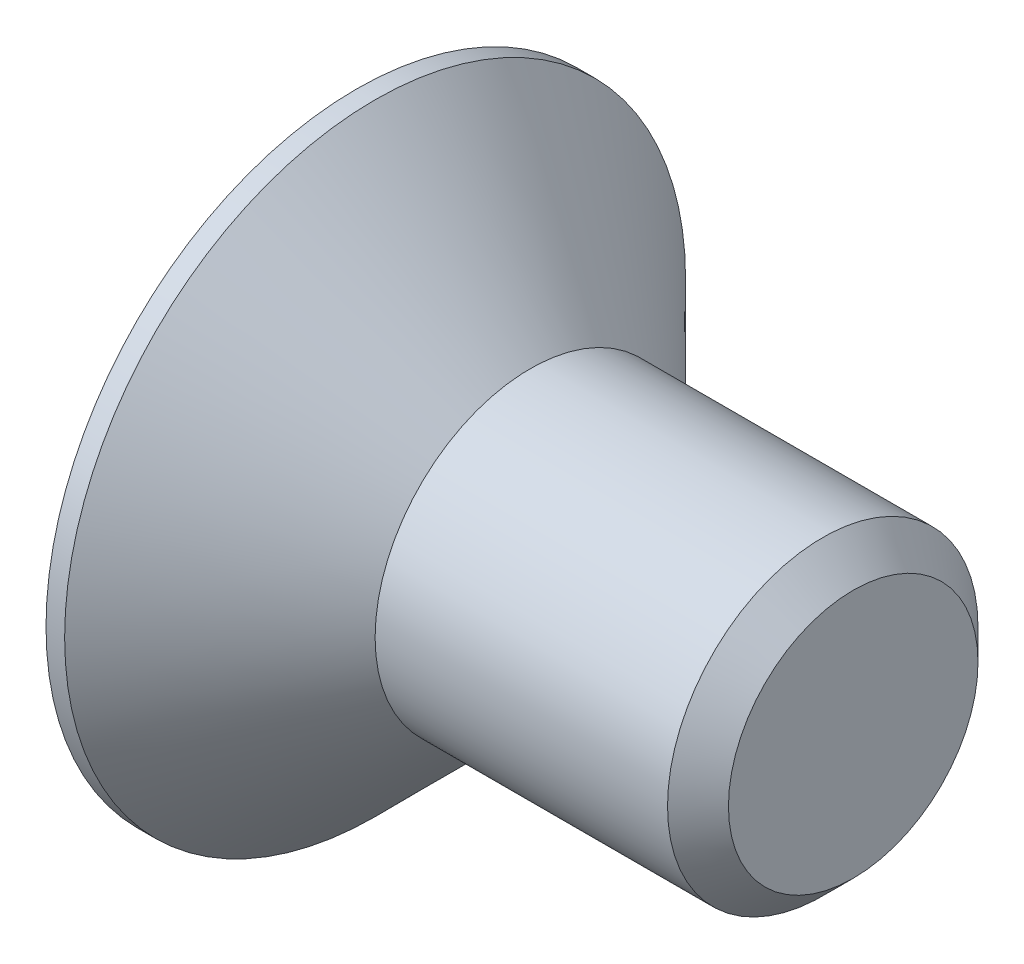
ISO-10303-21;
HEADER;
FILE_DESCRIPTION(('STEP AP214'),'2;1');
FILE_NAME('part.step','',(''),(''),'','','');
FILE_SCHEMA(('AUTOMOTIVE_DESIGN { 1 0 10303 214 1 1 1 1 }'));
ENDSEC;
DATA;
#1=APPLICATION_CONTEXT('core data for automotive mechanical design processes');
#2=APPLICATION_PROTOCOL_DEFINITION('international standard','automotive_design',2000,#1);
#3=PRODUCT_CONTEXT('',#1,'mechanical');
#4=PRODUCT('Part','Part','',(#3));
#5=PRODUCT_RELATED_PRODUCT_CATEGORY('part','',(#4));
#6=PRODUCT_DEFINITION_FORMATION('','',#4);
#7=PRODUCT_DEFINITION_CONTEXT('part definition',#1,'design');
#8=PRODUCT_DEFINITION('design','',#6,#7);
#9=PRODUCT_DEFINITION_SHAPE('','',#8);
#10=(LENGTH_UNIT() NAMED_UNIT(*) SI_UNIT(.MILLI.,.METRE.));
#11=(NAMED_UNIT(*) PLANE_ANGLE_UNIT() SI_UNIT($,.RADIAN.));
#12=(NAMED_UNIT(*) SI_UNIT($,.STERADIAN.) SOLID_ANGLE_UNIT());
#13=UNCERTAINTY_MEASURE_WITH_UNIT(LENGTH_MEASURE(1.E-05),#10,'distance_accuracy_value','');
#14=(GEOMETRIC_REPRESENTATION_CONTEXT(3) GLOBAL_UNCERTAINTY_ASSIGNED_CONTEXT((#13)) GLOBAL_UNIT_ASSIGNED_CONTEXT((#10,
#11,#12)) REPRESENTATION_CONTEXT('',''));
#15=CARTESIAN_POINT('',(0.,0.,0.));
#16=DIRECTION('',(0.,0.,1.));
#17=DIRECTION('',(1.,0.,0.));
#18=AXIS2_PLACEMENT_3D('',#15,#16,#17);
#19=CARTESIAN_POINT('',(-2.79999999999997,1.11022302462516E-13,-8.32667268468867E-13));
#20=DIRECTION('',(1.,0.,0.));
#21=DIRECTION('',(0.,0.,-1.00000000000002));
#22=AXIS2_PLACEMENT_3D('',#19,#20,#21);
#23=PLANE('',#22);
#24=CARTESIAN_POINT('',(-2.79999999999997,1.11022302462516E-13,-8.32667268468867E-13));
#25=DIRECTION('',(1.,0.,0.));
#26=DIRECTION('',(0.,0.,-1.00000000000002));
#27=AXIS2_PLACEMENT_3D('',#24,#25,#26);
#28=CIRCLE('',#27,5.);
#29=CARTESIAN_POINT('',(-2.79999999999997,1.10189635194047E-13,-5.00000000000092));
#30=VERTEX_POINT('',#29);
#31=EDGE_CURVE('E11',#30,#30,#28,.T.);
#32=ORIENTED_EDGE('',*,*,#31,.F.);
#33=EDGE_LOOP('',(#32));
#34=FACE_BOUND('',#33,.T.);
#35=DIRECTION('',(0.,0.500000000000011,-0.866025403784455));
#36=VECTOR('',#35,1.);
#37=CARTESIAN_POINT('',(-2.79999999999947,-1.73205080756911,4.44089209850063E-13));
#38=LINE('',#37,#36);
#39=CARTESIAN_POINT('',(-2.79999999999947,-1.73205080756911,4.44089209850063E-13));
#40=VERTEX_POINT('',#39);
#41=CARTESIAN_POINT('',(-2.7999999999998,-0.866025403784221,-1.50000000000039));
#42=VERTEX_POINT('',#41);
#43=EDGE_CURVE('E149',#40,#42,#38,.T.);
#44=ORIENTED_EDGE('',*,*,#43,.T.);
#45=DIRECTION('',(0.,1.00000000000002,0.));
#46=VECTOR('',#45,1.);
#47=CARTESIAN_POINT('',(-2.7999999999998,-0.866025403784221,-1.50000000000039));
#48=LINE('',#47,#46);
#49=CARTESIAN_POINT('',(-2.80000000000019,0.866025403784443,-1.50000000000078));
#50=VERTEX_POINT('',#49);
#51=EDGE_CURVE('E151',#42,#50,#48,.T.);
#52=ORIENTED_EDGE('',*,*,#51,.T.);
#53=DIRECTION('',(0.,0.500000000000011,0.866025403784455));
#54=VECTOR('',#53,1.);
#55=CARTESIAN_POINT('',(-2.80000000000019,0.866025403784443,-1.50000000000078));
#56=LINE('',#55,#54);
#57=CARTESIAN_POINT('',(-2.80000000000069,1.73205080756911,-8.88178419700125E-13));
#58=VERTEX_POINT('',#57);
#59=EDGE_CURVE('E154',#50,#58,#56,.T.);
#60=ORIENTED_EDGE('',*,*,#59,.T.);
#61=DIRECTION('',(0.,-0.500000000000011,0.866025403784455));
#62=VECTOR('',#61,1.);
#63=CARTESIAN_POINT('',(-2.80000000000069,1.73205080756911,-8.88178419700125E-13));
#64=LINE('',#63,#62);
#65=CARTESIAN_POINT('',(-2.80000000000036,0.866025403784998,1.49999999999961));
#66=VERTEX_POINT('',#65);
#67=EDGE_CURVE('E99',#58,#66,#64,.T.);
#68=ORIENTED_EDGE('',*,*,#67,.T.);
#69=DIRECTION('',(0.,-1.00000000000002,0.));
#70=VECTOR('',#69,1.);
#71=CARTESIAN_POINT('',(-2.80000000000036,0.866025403784998,1.49999999999961));
#72=LINE('',#71,#70);
#73=CARTESIAN_POINT('',(-2.79999999999997,-0.866025403784443,1.49999999999956));
#74=VERTEX_POINT('',#73);
#75=EDGE_CURVE('E156',#66,#74,#72,.T.);
#76=ORIENTED_EDGE('',*,*,#75,.T.);
#77=DIRECTION('',(0.,-0.500000000000011,-0.866025403784455));
#78=VECTOR('',#77,1.);
#79=CARTESIAN_POINT('',(-2.79999999999997,-0.866025403784443,1.49999999999956));
#80=LINE('',#79,#78);
#81=EDGE_CURVE('E114',#74,#40,#80,.T.);
#82=ORIENTED_EDGE('',*,*,#81,.T.);
#83=EDGE_LOOP('',(#44,#52,#60,#68,#76,#82));
#84=FACE_BOUND('',#83,.T.);
#85=ADVANCED_FACE('F16',(#34,#84),#23,.F.);
#86=CARTESIAN_POINT('',(5.19999999999998,0.,-5.55111512312578E-13));
#87=DIRECTION('',(1.,0.,0.));
#88=DIRECTION('',(0.,0.,-1.00000000000002));
#89=AXIS2_PLACEMENT_3D('',#86,#87,#88);
#90=CYLINDRICAL_SURFACE('',#89,5.);
#91=CARTESIAN_POINT('',(-2.5,2.22044604925031E-13,-1.0547118733939E-12));
#92=DIRECTION('',(1.,0.,0.));
#93=DIRECTION('',(0.,0.,-1.00000000000002));
#94=AXIS2_PLACEMENT_3D('',#91,#92,#93);
#95=CIRCLE('',#94,5.);
#96=CARTESIAN_POINT('',(-2.5,2.21211937656562E-13,-5.00000000000114));
#97=VERTEX_POINT('',#96);
#98=EDGE_CURVE('E23',#97,#97,#95,.T.);
#99=ORIENTED_EDGE('',*,*,#98,.F.);
#100=EDGE_LOOP('',(#99));
#101=FACE_BOUND('',#100,.T.);
#102=ORIENTED_EDGE('',*,*,#31,.T.);
#103=EDGE_LOOP('',(#102));
#104=FACE_BOUND('',#103,.T.);
#105=ADVANCED_FACE('F140',(#101,#104),#90,.T.);
#106=CARTESIAN_POINT('',(-2.5,2.22044604925031E-13,-1.0547118733939E-12));
#107=DIRECTION('',(-1.,0.,0.));
#108=DIRECTION('',(0.,0.,1.00000000000002));
#109=AXIS2_PLACEMENT_3D('',#106,#107,#108);
#110=CONICAL_SURFACE('',#109,5.,0.785398163397448);
#111=CARTESIAN_POINT('',(0.,0.,0.));
#112=DIRECTION('',(1.,0.,0.));
#113=DIRECTION('',(0.,0.,-1.00000000000002));
#114=AXIS2_PLACEMENT_3D('',#111,#112,#113);
#115=CIRCLE('',#114,2.5);
#116=CARTESIAN_POINT('',(0.,0.,-2.50000000000004));
#117=VERTEX_POINT('',#116);
#118=EDGE_CURVE('E133',#117,#117,#115,.T.);
#119=ORIENTED_EDGE('',*,*,#118,.F.);
#120=EDGE_LOOP('',(#119));
#121=FACE_BOUND('',#120,.T.);
#122=ORIENTED_EDGE('',*,*,#98,.T.);
#123=EDGE_LOOP('',(#122));
#124=FACE_BOUND('',#123,.T.);
#125=ADVANCED_FACE('F138',(#121,#124),#110,.T.);
#126=CARTESIAN_POINT('',(5.19999999999998,0.,-5.55111512312578E-13));
#127=DIRECTION('',(1.,0.,0.));
#128=DIRECTION('',(0.,0.,-1.00000000000002));
#129=AXIS2_PLACEMENT_3D('',#126,#127,#128);
#130=CYLINDRICAL_SURFACE('',#129,2.5);
#131=CARTESIAN_POINT('',(4.70949999999998,-7.7715611723761E-13,-2.22044604925031E-13));
#132=DIRECTION('',(1.,0.,0.));
#133=DIRECTION('',(0.,0.,-1.00000000000002));
#134=AXIS2_PLACEMENT_3D('',#131,#132,#133);
#135=CIRCLE('',#134,2.5);
#136=CARTESIAN_POINT('',(4.70949999999998,-7.77572450871844E-13,-2.50000000000027));
#137=VERTEX_POINT('',#136);
#138=EDGE_CURVE('E130',#137,#137,#135,.T.);
#139=ORIENTED_EDGE('',*,*,#138,.F.);
#140=EDGE_LOOP('',(#139));
#141=FACE_BOUND('',#140,.T.);
#142=ORIENTED_EDGE('',*,*,#118,.T.);
#143=EDGE_LOOP('',(#142));
#144=FACE_BOUND('',#143,.T.);
#145=ADVANCED_FACE('F243',(#141,#144),#130,.T.);
#146=CARTESIAN_POINT('',(4.70949999999998,-7.7715611723761E-13,-2.22044604925031E-13));
#147=DIRECTION('',(-1.,0.,0.));
#148=DIRECTION('',(0.,0.,1.00000000000002));
#149=AXIS2_PLACEMENT_3D('',#146,#147,#148);
#150=CONICAL_SURFACE('',#149,2.5,0.785398163397448);
#151=CARTESIAN_POINT('',(5.19999999999998,0.,-5.55111512312578E-13));
#152=DIRECTION('',(1.,0.,0.));
#153=DIRECTION('',(0.,0.,-1.00000000000002));
#154=AXIS2_PLACEMENT_3D('',#151,#152,#153);
#155=CIRCLE('',#154,2.0095);
#156=CARTESIAN_POINT('',(5.19999999999998,0.,-2.00950000000059));
#157=VERTEX_POINT('',#156);
#158=EDGE_CURVE('E126',#157,#157,#155,.T.);
#159=ORIENTED_EDGE('',*,*,#158,.F.);
#160=EDGE_LOOP('',(#159));
#161=FACE_BOUND('',#160,.T.);
#162=ORIENTED_EDGE('',*,*,#138,.T.);
#163=EDGE_LOOP('',(#162));
#164=FACE_BOUND('',#163,.T.);
#165=ADVANCED_FACE('F239',(#161,#164),#150,.T.);
#166=CARTESIAN_POINT('',(5.19999999999943,2.00950000000022,-6.10622663543836E-13));
#167=DIRECTION('',(-1.,0.,0.));
#168=DIRECTION('',(0.,0.,1.00000000000002));
#169=AXIS2_PLACEMENT_3D('',#166,#167,#168);
#170=PLANE('',#169);
#171=ORIENTED_EDGE('',*,*,#158,.T.);
#172=EDGE_LOOP('',(#171));
#173=FACE_BOUND('',#172,.T.);
#174=ADVANCED_FACE('F234',(#173),#170,.F.);
#175=CARTESIAN_POINT('',(-1.4000000000004,0.866025403784665,1.50000000000011));
#176=DIRECTION('',(0.,0.,-1.00000000000002));
#177=DIRECTION('',(-1.,0.,0.));
#178=AXIS2_PLACEMENT_3D('',#175,#176,#177);
#179=PLANE('',#178);
#180=ORIENTED_EDGE('',*,*,#75,.F.);
#181=DIRECTION('',(-1.,0.,0.));
#182=VECTOR('',#181,1.);
#183=CARTESIAN_POINT('',(-1.4000000000004,0.866025403784665,1.50000000000011));
#184=LINE('',#183,#182);
#185=CARTESIAN_POINT('',(-1.4000000000004,0.866025403784665,1.50000000000011));
#186=VERTEX_POINT('',#185);
#187=EDGE_CURVE('E163',#186,#66,#184,.T.);
#188=ORIENTED_EDGE('',*,*,#187,.F.);
#189=DIRECTION('',(0.,-1.00000000000002,0.));
#190=VECTOR('',#189,1.);
#191=CARTESIAN_POINT('',(-1.4000000000004,0.866025403784665,1.50000000000011));
#192=LINE('',#191,#190);
#193=CARTESIAN_POINT('',(-1.40000000000007,0.,1.49999999999906));
#194=VERTEX_POINT('',#193);
#195=EDGE_CURVE('E96',#186,#194,#192,.T.);
#196=ORIENTED_EDGE('',*,*,#195,.T.);
#197=CARTESIAN_POINT('',(-1.39999999999996,-0.866025403784887,1.49999999999995));
#198=VERTEX_POINT('',#197);
#199=EDGE_CURVE('E88',#194,#198,#192,.T.);
#200=ORIENTED_EDGE('',*,*,#199,.T.);
#201=DIRECTION('',(-1.,0.,0.));
#202=VECTOR('',#201,1.);
#203=CARTESIAN_POINT('',(-1.39999999999996,-0.866025403784887,1.49999999999995));
#204=LINE('',#203,#202);
#205=EDGE_CURVE('E92',#198,#74,#204,.T.);
#206=ORIENTED_EDGE('',*,*,#205,.T.);
#207=EDGE_LOOP('',(#180,#188,#196,#200,#206));
#208=FACE_BOUND('',#207,.T.);
#209=ADVANCED_FACE('F90',(#208),#179,.T.);
#210=CARTESIAN_POINT('',(-1.39999999999996,-0.866025403784887,1.49999999999995));
#211=DIRECTION('',(0.,0.86602540378446,-0.500000000000009));
#212=DIRECTION('',(0.,0.500000000000011,0.866025403784455));
#213=AXIS2_PLACEMENT_3D('',#210,#211,#212);
#214=PLANE('',#213);
#215=ORIENTED_EDGE('',*,*,#81,.F.);
#216=ORIENTED_EDGE('',*,*,#205,.F.);
#217=DIRECTION('',(0.,-0.500000000000011,-0.866025403784455));
#218=VECTOR('',#217,1.);
#219=CARTESIAN_POINT('',(-1.39999999999996,-0.866025403784887,1.49999999999995));
#220=LINE('',#219,#218);
#221=CARTESIAN_POINT('',(-1.39999999999979,-1.29903810567655,0.749999999999917));
#222=VERTEX_POINT('',#221);
#223=EDGE_CURVE('E102',#198,#222,#220,.T.);
#224=ORIENTED_EDGE('',*,*,#223,.T.);
#225=CARTESIAN_POINT('',(-1.39999999999951,-1.73205080756922,1.11022302462516E-13));
#226=VERTEX_POINT('',#225);
#227=EDGE_CURVE('E109',#222,#226,#220,.T.);
#228=ORIENTED_EDGE('',*,*,#227,.T.);
#229=DIRECTION('',(-1.,0.,0.));
#230=VECTOR('',#229,1.);
#231=CARTESIAN_POINT('',(-1.39999999999951,-1.73205080756922,1.11022302462516E-13));
#232=LINE('',#231,#230);
#233=EDGE_CURVE('E116',#226,#40,#232,.T.);
#234=ORIENTED_EDGE('',*,*,#233,.T.);
#235=EDGE_LOOP('',(#215,#216,#224,#228,#234));
#236=FACE_BOUND('',#235,.T.);
#237=ADVANCED_FACE('F111',(#236),#214,.T.);
#238=CARTESIAN_POINT('',(-1.39999999999951,-1.73205080756922,1.11022302462516E-13));
#239=DIRECTION('',(0.,0.86602540378446,0.500000000000008));
#240=DIRECTION('',(0.,-0.500000000000011,0.866025403784455));
#241=AXIS2_PLACEMENT_3D('',#238,#239,#240);
#242=PLANE('',#241);
#243=ORIENTED_EDGE('',*,*,#43,.F.);
#244=ORIENTED_EDGE('',*,*,#233,.F.);
#245=DIRECTION('',(0.,0.500000000000011,-0.866025403784455));
#246=VECTOR('',#245,1.);
#247=CARTESIAN_POINT('',(-1.39999999999951,-1.73205080756922,1.11022302462516E-13));
#248=LINE('',#247,#246);
#249=CARTESIAN_POINT('',(-1.39999999999968,-1.29903810567666,-0.749999999999973));
#250=VERTEX_POINT('',#249);
#251=EDGE_CURVE('E30',#226,#250,#248,.T.);
#252=ORIENTED_EDGE('',*,*,#251,.T.);
#253=CARTESIAN_POINT('',(-1.39999999999985,-0.866025403784665,-1.5000000000005));
#254=VERTEX_POINT('',#253);
#255=EDGE_CURVE('E108',#250,#254,#248,.T.);
#256=ORIENTED_EDGE('',*,*,#255,.T.);
#257=DIRECTION('',(-1.,0.,0.));
#258=VECTOR('',#257,1.);
#259=CARTESIAN_POINT('',(-1.39999999999985,-0.866025403784665,-1.5000000000005));
#260=LINE('',#259,#258);
#261=EDGE_CURVE('E122',#254,#42,#260,.T.);
#262=ORIENTED_EDGE('',*,*,#261,.T.);
#263=EDGE_LOOP('',(#243,#244,#252,#256,#262));
#264=FACE_BOUND('',#263,.T.);
#265=ADVANCED_FACE('F173',(#264),#242,.T.);
#266=CARTESIAN_POINT('',(-1.39999999999985,-0.866025403784665,-1.5000000000005));
#267=DIRECTION('',(0.,0.,1.00000000000002));
#268=DIRECTION('',(1.,0.,0.));
#269=AXIS2_PLACEMENT_3D('',#266,#267,#268);
#270=PLANE('',#269);
#271=ORIENTED_EDGE('',*,*,#51,.F.);
#272=ORIENTED_EDGE('',*,*,#261,.F.);
#273=DIRECTION('',(0.,1.00000000000002,0.));
#274=VECTOR('',#273,1.);
#275=CARTESIAN_POINT('',(-1.39999999999985,-0.866025403784665,-1.5000000000005));
#276=LINE('',#275,#274);
#277=CARTESIAN_POINT('',(-1.40000000000007,0.,-1.50000000000017));
#278=VERTEX_POINT('',#277);
#279=EDGE_CURVE('E178',#254,#278,#276,.T.);
#280=ORIENTED_EDGE('',*,*,#279,.T.);
#281=CARTESIAN_POINT('',(-1.40000000000018,0.866025403784443,-1.50000000000083));
#282=VERTEX_POINT('',#281);
#283=EDGE_CURVE('E186',#278,#282,#276,.T.);
#284=ORIENTED_EDGE('',*,*,#283,.T.);
#285=DIRECTION('',(-1.,0.,0.));
#286=VECTOR('',#285,1.);
#287=CARTESIAN_POINT('',(-1.40000000000018,0.866025403784443,-1.50000000000083));
#288=LINE('',#287,#286);
#289=EDGE_CURVE('E170',#282,#50,#288,.T.);
#290=ORIENTED_EDGE('',*,*,#289,.T.);
#291=EDGE_LOOP('',(#271,#272,#280,#284,#290));
#292=FACE_BOUND('',#291,.T.);
#293=ADVANCED_FACE('F177',(#292),#270,.T.);
#294=CARTESIAN_POINT('',(-1.40000000000018,0.866025403784443,-1.50000000000083));
#295=DIRECTION('',(0.,-0.86602540378446,0.500000000000009));
#296=DIRECTION('',(0.,-0.500000000000011,-0.866025403784455));
#297=AXIS2_PLACEMENT_3D('',#294,#295,#296);
#298=PLANE('',#297);
#299=ORIENTED_EDGE('',*,*,#59,.F.);
#300=ORIENTED_EDGE('',*,*,#289,.F.);
#301=DIRECTION('',(0.,0.500000000000011,0.866025403784455));
#302=VECTOR('',#301,1.);
#303=CARTESIAN_POINT('',(-1.40000000000018,0.866025403784443,-1.50000000000083));
#304=LINE('',#303,#302);
#305=CARTESIAN_POINT('',(-1.40000000000068,1.29903810567678,-0.750000000000861));
#306=VERTEX_POINT('',#305);
#307=EDGE_CURVE('E188',#282,#306,#304,.T.);
#308=ORIENTED_EDGE('',*,*,#307,.T.);
#309=CARTESIAN_POINT('',(-1.40000000000068,1.732050807569,-6.10622663543836E-13));
#310=VERTEX_POINT('',#309);
#311=EDGE_CURVE('E185',#306,#310,#304,.T.);
#312=ORIENTED_EDGE('',*,*,#311,.T.);
#313=DIRECTION('',(-1.,0.,0.));
#314=VECTOR('',#313,1.);
#315=CARTESIAN_POINT('',(-1.40000000000068,1.732050807569,-6.10622663543836E-13));
#316=LINE('',#315,#314);
#317=EDGE_CURVE('E166',#310,#58,#316,.T.);
#318=ORIENTED_EDGE('',*,*,#317,.T.);
#319=EDGE_LOOP('',(#299,#300,#308,#312,#318));
#320=FACE_BOUND('',#319,.T.);
#321=ADVANCED_FACE('F216',(#320),#298,.T.);
#322=CARTESIAN_POINT('',(-1.40000000000068,1.732050807569,-6.10622663543836E-13));
#323=DIRECTION('',(0.,-0.86602540378446,-0.500000000000008));
#324=DIRECTION('',(0.,0.500000000000011,-0.866025403784455));
#325=AXIS2_PLACEMENT_3D('',#322,#323,#324);
#326=PLANE('',#325);
#327=ORIENTED_EDGE('',*,*,#67,.F.);
#328=ORIENTED_EDGE('',*,*,#317,.F.);
#329=DIRECTION('',(0.,-0.500000000000011,0.866025403784455));
#330=VECTOR('',#329,1.);
#331=CARTESIAN_POINT('',(-1.40000000000068,1.732050807569,-6.10622663543836E-13));
#332=LINE('',#331,#330);
#333=CARTESIAN_POINT('',(-1.40000000000068,1.299038105677,0.749999999999418));
#334=VERTEX_POINT('',#333);
#335=EDGE_CURVE('E167',#310,#334,#332,.T.);
#336=ORIENTED_EDGE('',*,*,#335,.T.);
#337=EDGE_CURVE('E193',#334,#186,#332,.T.);
#338=ORIENTED_EDGE('',*,*,#337,.T.);
#339=ORIENTED_EDGE('',*,*,#187,.T.);
#340=EDGE_LOOP('',(#327,#328,#336,#338,#339));
#341=FACE_BOUND('',#340,.T.);
#342=ADVANCED_FACE('F196',(#341),#326,.T.);
#343=CARTESIAN_POINT('',(-1.40000000000001,0.,0.));
#344=DIRECTION('',(1.,0.,0.));
#345=DIRECTION('',(0.,0.,-1.00000000000002));
#346=AXIS2_PLACEMENT_3D('',#343,#344,#345);
#347=PLANE('',#346);
#348=CARTESIAN_POINT('',(-1.40000000000001,0.,0.));
#349=DIRECTION('',(1.,0.,0.));
#350=DIRECTION('',(0.,0.,-1.00000000000002));
#351=AXIS2_PLACEMENT_3D('',#348,#349,#350);
#352=CIRCLE('',#351,1.5);
#353=EDGE_CURVE('E115',#278,#306,#352,.T.);
#354=ORIENTED_EDGE('',*,*,#353,.T.);
#355=ORIENTED_EDGE('',*,*,#307,.F.);
#356=ORIENTED_EDGE('',*,*,#283,.F.);
#357=EDGE_LOOP('',(#354,#355,#356));
#358=FACE_BOUND('',#357,.T.);
#359=ADVANCED_FACE('F211',(#358),#347,.F.);
#360=ORIENTED_EDGE('',*,*,#311,.F.);
#361=EDGE_CURVE('E121',#306,#334,#352,.T.);
#362=ORIENTED_EDGE('',*,*,#361,.T.);
#363=ORIENTED_EDGE('',*,*,#335,.F.);
#364=EDGE_LOOP('',(#360,#362,#363));
#365=FACE_BOUND('',#364,.T.);
#366=ADVANCED_FACE('F213',(#365),#347,.F.);
#367=EDGE_CURVE('E127',#334,#194,#352,.T.);
#368=ORIENTED_EDGE('',*,*,#367,.T.);
#369=ORIENTED_EDGE('',*,*,#195,.F.);
#370=ORIENTED_EDGE('',*,*,#337,.F.);
#371=EDGE_LOOP('',(#368,#369,#370));
#372=FACE_BOUND('',#371,.T.);
#373=ADVANCED_FACE('F202',(#372),#347,.F.);
#374=EDGE_CURVE('E104',#194,#222,#352,.T.);
#375=ORIENTED_EDGE('',*,*,#374,.T.);
#376=ORIENTED_EDGE('',*,*,#223,.F.);
#377=ORIENTED_EDGE('',*,*,#199,.F.);
#378=EDGE_LOOP('',(#375,#376,#377));
#379=FACE_BOUND('',#378,.T.);
#380=ADVANCED_FACE('F103',(#379),#347,.F.);
#381=EDGE_CURVE('E205',#222,#250,#352,.T.);
#382=ORIENTED_EDGE('',*,*,#381,.T.);
#383=ORIENTED_EDGE('',*,*,#251,.F.);
#384=ORIENTED_EDGE('',*,*,#227,.F.);
#385=EDGE_LOOP('',(#382,#383,#384));
#386=FACE_BOUND('',#385,.T.);
#387=ADVANCED_FACE('F204',(#386),#347,.F.);
#388=EDGE_CURVE('E119',#250,#278,#352,.T.);
#389=ORIENTED_EDGE('',*,*,#388,.T.);
#390=ORIENTED_EDGE('',*,*,#279,.F.);
#391=ORIENTED_EDGE('',*,*,#255,.F.);
#392=EDGE_LOOP('',(#389,#390,#391));
#393=FACE_BOUND('',#392,.T.);
#394=ADVANCED_FACE('F181',(#393),#347,.F.);
#395=CARTESIAN_POINT('',(-1.40000000000001,0.,0.));
#396=DIRECTION('',(-1.,0.,0.));
#397=DIRECTION('',(0.,0.,1.00000000000002));
#398=AXIS2_PLACEMENT_3D('',#395,#396,#397);
#399=CONICAL_SURFACE('',#398,1.5,1.30899693899575);
#400=CARTESIAN_POINT('',(-0.998076211353338,1.11022302462516E-13,-5.55111512312578E-13));
#401=VERTEX_POINT('',#400);
#402=VERTEX_LOOP('',#401);
#403=FACE_BOUND('',#402,.T.);
#404=ORIENTED_EDGE('',*,*,#361,.F.);
#405=ORIENTED_EDGE('',*,*,#353,.F.);
#406=ORIENTED_EDGE('',*,*,#388,.F.);
#407=ORIENTED_EDGE('',*,*,#381,.F.);
#408=ORIENTED_EDGE('',*,*,#374,.F.);
#409=ORIENTED_EDGE('',*,*,#367,.F.);
#410=EDGE_LOOP('',(#404,#405,#406,#407,#408,#409));
#411=FACE_BOUND('',#410,.T.);
#412=ADVANCED_FACE('F207',(#403,#411),#399,.F.);
#413=CLOSED_SHELL('',(#85,#105,#125,#145,#165,#174,#209,#237,#265,#293,#321,#342,#359,#366,#373,
#380,#387,#394,#412));
#414=MANIFOLD_SOLID_BREP('B1',#413);
#415=ADVANCED_BREP_SHAPE_REPRESENTATION('',(#18,#414),#14);
#416=SHAPE_DEFINITION_REPRESENTATION(#9,#415);
ENDSEC;
END-ISO-10303-21;
